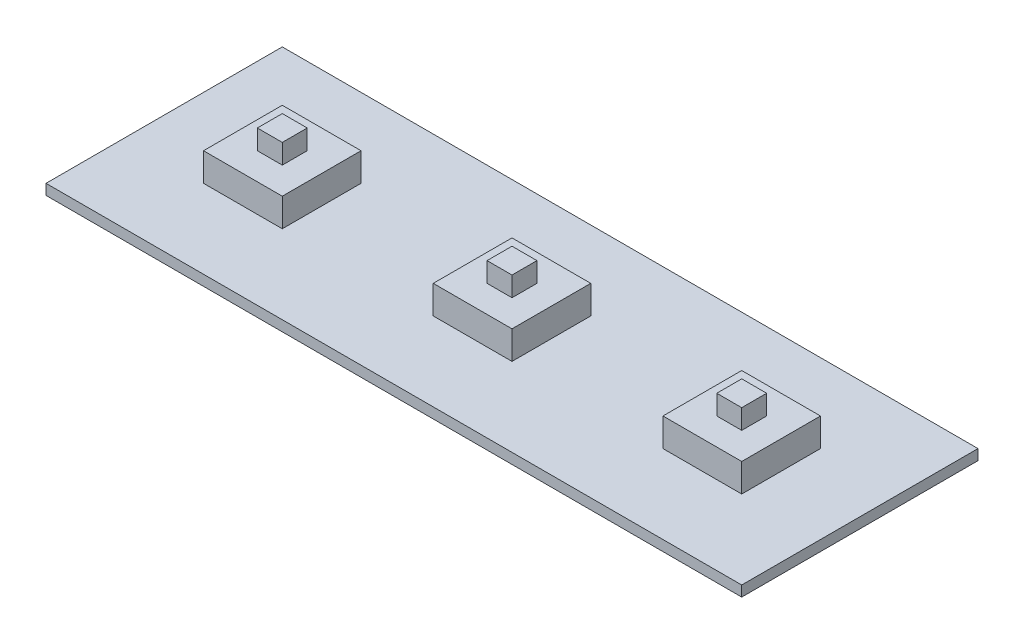
ISO-10303-21;
HEADER;
FILE_DESCRIPTION(('STEP AP214'),'2;1');
FILE_NAME('part.step','',(''),(''),'','','');
FILE_SCHEMA(('AUTOMOTIVE_DESIGN { 1 0 10303 214 1 1 1 1 }'));
ENDSEC;
DATA;
#1=APPLICATION_CONTEXT('core data for automotive mechanical design processes');
#2=APPLICATION_PROTOCOL_DEFINITION('international standard','automotive_design',2000,#1);
#3=PRODUCT_CONTEXT('',#1,'mechanical');
#4=PRODUCT('Part','Part','',(#3));
#5=PRODUCT_RELATED_PRODUCT_CATEGORY('part','',(#4));
#6=PRODUCT_DEFINITION_FORMATION('','',#4);
#7=PRODUCT_DEFINITION_CONTEXT('part definition',#1,'design');
#8=PRODUCT_DEFINITION('design','',#6,#7);
#9=PRODUCT_DEFINITION_SHAPE('','',#8);
#10=(LENGTH_UNIT() NAMED_UNIT(*) SI_UNIT(.MILLI.,.METRE.));
#11=(NAMED_UNIT(*) PLANE_ANGLE_UNIT() SI_UNIT($,.RADIAN.));
#12=(NAMED_UNIT(*) SI_UNIT($,.STERADIAN.) SOLID_ANGLE_UNIT());
#13=UNCERTAINTY_MEASURE_WITH_UNIT(LENGTH_MEASURE(1.E-05),#10,'distance_accuracy_value','');
#14=(GEOMETRIC_REPRESENTATION_CONTEXT(3) GLOBAL_UNCERTAINTY_ASSIGNED_CONTEXT((#13)) GLOBAL_UNIT_ASSIGNED_CONTEXT((#10,
#11,#12)) REPRESENTATION_CONTEXT('',''));
#15=CARTESIAN_POINT('',(0.,0.,0.));
#16=DIRECTION('',(0.,0.,1.));
#17=DIRECTION('',(1.,0.,0.));
#18=AXIS2_PLACEMENT_3D('',#15,#16,#17);
#19=CARTESIAN_POINT('',(0.,0.,0.));
#20=DIRECTION('',(0.,-1.,0.));
#21=DIRECTION('',(0.,0.,-1.));
#22=AXIS2_PLACEMENT_3D('',#19,#20,#21);
#23=PLANE('',#22);
#24=DIRECTION('',(0.,0.,1.));
#25=VECTOR('',#24,1.);
#26=CARTESIAN_POINT('',(35.,0.,-12.));
#27=LINE('',#26,#25);
#28=CARTESIAN_POINT('',(35.,0.,-12.));
#29=VERTEX_POINT('',#28);
#30=CARTESIAN_POINT('',(35.,0.,0.));
#31=VERTEX_POINT('',#30);
#32=EDGE_CURVE('E316',#29,#31,#27,.T.);
#33=ORIENTED_EDGE('',*,*,#32,.F.);
#34=DIRECTION('',(-1.,0.,0.));
#35=VECTOR('',#34,1.);
#36=CARTESIAN_POINT('',(35.,0.,-12.));
#37=LINE('',#36,#35);
#38=CARTESIAN_POINT('',(47.,0.,-12.));
#39=VERTEX_POINT('',#38);
#40=EDGE_CURVE('E321',#39,#29,#37,.T.);
#41=ORIENTED_EDGE('',*,*,#40,.F.);
#42=DIRECTION('',(0.,0.,-1.));
#43=VECTOR('',#42,1.);
#44=CARTESIAN_POINT('',(47.,0.,-12.));
#45=LINE('',#44,#43);
#46=CARTESIAN_POINT('',(47.,0.,0.));
#47=VERTEX_POINT('',#46);
#48=EDGE_CURVE('E333',#47,#39,#45,.T.);
#49=ORIENTED_EDGE('',*,*,#48,.F.);
#50=DIRECTION('',(1.,0.,0.));
#51=VECTOR('',#50,1.);
#52=CARTESIAN_POINT('',(35.,0.,0.));
#53=LINE('',#52,#51);
#54=EDGE_CURVE('E330',#31,#47,#53,.T.);
#55=ORIENTED_EDGE('',*,*,#54,.F.);
#56=EDGE_LOOP('',(#33,#41,#49,#55));
#57=FACE_BOUND('',#56,.T.);
#58=DIRECTION('',(0.,0.,1.));
#59=VECTOR('',#58,1.);
#60=CARTESIAN_POINT('',(0.,0.,0.));
#61=LINE('',#60,#59);
#62=CARTESIAN_POINT('',(0.,0.,-12.));
#63=VERTEX_POINT('',#62);
#64=CARTESIAN_POINT('',(0.,0.,0.));
#65=VERTEX_POINT('',#64);
#66=EDGE_CURVE('E410',#63,#65,#61,.T.);
#67=ORIENTED_EDGE('',*,*,#66,.F.);
#68=DIRECTION('',(-1.,0.,0.));
#69=VECTOR('',#68,1.);
#70=CARTESIAN_POINT('',(0.,0.,-12.));
#71=LINE('',#70,#69);
#72=CARTESIAN_POINT('',(12.,0.,-12.));
#73=VERTEX_POINT('',#72);
#74=EDGE_CURVE('E415',#73,#63,#71,.T.);
#75=ORIENTED_EDGE('',*,*,#74,.F.);
#76=DIRECTION('',(0.,0.,-1.));
#77=VECTOR('',#76,1.);
#78=CARTESIAN_POINT('',(12.,0.,0.));
#79=LINE('',#78,#77);
#80=CARTESIAN_POINT('',(12.,0.,0.));
#81=VERTEX_POINT('',#80);
#82=EDGE_CURVE('E427',#81,#73,#79,.T.);
#83=ORIENTED_EDGE('',*,*,#82,.F.);
#84=DIRECTION('',(1.,0.,0.));
#85=VECTOR('',#84,1.);
#86=CARTESIAN_POINT('',(0.,0.,0.));
#87=LINE('',#86,#85);
#88=EDGE_CURVE('E424',#65,#81,#87,.T.);
#89=ORIENTED_EDGE('',*,*,#88,.F.);
#90=EDGE_LOOP('',(#67,#75,#83,#89));
#91=FACE_BOUND('',#90,.T.);
#92=DIRECTION('',(0.,0.,-1.));
#93=VECTOR('',#92,1.);
#94=CARTESIAN_POINT('',(-12.,0.,12.));
#95=LINE('',#94,#93);
#96=CARTESIAN_POINT('',(-12.,0.,12.));
#97=VERTEX_POINT('',#96);
#98=CARTESIAN_POINT('',(-12.,0.,-24.));
#99=VERTEX_POINT('',#98);
#100=EDGE_CURVE('E349',#97,#99,#95,.T.);
#101=ORIENTED_EDGE('',*,*,#100,.F.);
#102=DIRECTION('',(-1.,0.,0.));
#103=VECTOR('',#102,1.);
#104=CARTESIAN_POINT('',(-12.,0.,12.));
#105=LINE('',#104,#103);
#106=CARTESIAN_POINT('',(94.,0.,12.));
#107=VERTEX_POINT('',#106);
#108=EDGE_CURVE('E354',#107,#97,#105,.T.);
#109=ORIENTED_EDGE('',*,*,#108,.F.);
#110=DIRECTION('',(0.,0.,1.));
#111=VECTOR('',#110,1.);
#112=CARTESIAN_POINT('',(94.,0.,12.));
#113=LINE('',#112,#111);
#114=CARTESIAN_POINT('',(94.,0.,-24.));
#115=VERTEX_POINT('',#114);
#116=EDGE_CURVE('E365',#115,#107,#113,.T.);
#117=ORIENTED_EDGE('',*,*,#116,.F.);
#118=DIRECTION('',(1.,0.,0.));
#119=VECTOR('',#118,1.);
#120=CARTESIAN_POINT('',(-12.,0.,-24.));
#121=LINE('',#120,#119);
#122=EDGE_CURVE('E363',#99,#115,#121,.T.);
#123=ORIENTED_EDGE('',*,*,#122,.F.);
#124=EDGE_LOOP('',(#101,#109,#117,#123));
#125=FACE_BOUND('',#124,.T.);
#126=DIRECTION('',(0.,0.,1.));
#127=VECTOR('',#126,1.);
#128=CARTESIAN_POINT('',(70.,0.,-12.));
#129=LINE('',#128,#127);
#130=CARTESIAN_POINT('',(70.,0.,-12.));
#131=VERTEX_POINT('',#130);
#132=CARTESIAN_POINT('',(70.,0.,0.));
#133=VERTEX_POINT('',#132);
#134=EDGE_CURVE('E283',#131,#133,#129,.T.);
#135=ORIENTED_EDGE('',*,*,#134,.F.);
#136=DIRECTION('',(-1.,0.,0.));
#137=VECTOR('',#136,1.);
#138=CARTESIAN_POINT('',(70.,0.,-12.));
#139=LINE('',#138,#137);
#140=CARTESIAN_POINT('',(82.,0.,-12.));
#141=VERTEX_POINT('',#140);
#142=EDGE_CURVE('E288',#141,#131,#139,.T.);
#143=ORIENTED_EDGE('',*,*,#142,.F.);
#144=DIRECTION('',(0.,0.,-1.));
#145=VECTOR('',#144,1.);
#146=CARTESIAN_POINT('',(82.,0.,-12.));
#147=LINE('',#146,#145);
#148=CARTESIAN_POINT('',(82.,0.,0.));
#149=VERTEX_POINT('',#148);
#150=EDGE_CURVE('E300',#149,#141,#147,.T.);
#151=ORIENTED_EDGE('',*,*,#150,.F.);
#152=DIRECTION('',(1.,0.,0.));
#153=VECTOR('',#152,1.);
#154=CARTESIAN_POINT('',(70.,0.,0.));
#155=LINE('',#154,#153);
#156=EDGE_CURVE('E297',#133,#149,#155,.T.);
#157=ORIENTED_EDGE('',*,*,#156,.F.);
#158=EDGE_LOOP('',(#135,#143,#151,#157));
#159=FACE_BOUND('',#158,.T.);
#160=ADVANCED_FACE('F35',(#57,#91,#125,#159),#23,.F.);
#161=CARTESIAN_POINT('',(0.,4.3,0.));
#162=DIRECTION('',(1.,0.,0.));
#163=DIRECTION('',(0.,0.,-1.));
#164=AXIS2_PLACEMENT_3D('',#161,#162,#163);
#165=PLANE('',#164);
#166=ORIENTED_EDGE('',*,*,#66,.T.);
#167=DIRECTION('',(0.,-1.,0.));
#168=VECTOR('',#167,1.);
#169=CARTESIAN_POINT('',(0.,4.3,0.));
#170=LINE('',#169,#168);
#171=CARTESIAN_POINT('',(0.,4.3,0.));
#172=VERTEX_POINT('',#171);
#173=EDGE_CURVE('E11',#172,#65,#170,.T.);
#174=ORIENTED_EDGE('',*,*,#173,.F.);
#175=DIRECTION('',(0.,0.,1.));
#176=VECTOR('',#175,1.);
#177=CARTESIAN_POINT('',(0.,4.3,0.));
#178=LINE('',#177,#176);
#179=CARTESIAN_POINT('',(0.,4.3,-12.));
#180=VERTEX_POINT('',#179);
#181=EDGE_CURVE('E411',#180,#172,#178,.T.);
#182=ORIENTED_EDGE('',*,*,#181,.F.);
#183=DIRECTION('',(0.,-1.,0.));
#184=VECTOR('',#183,1.);
#185=CARTESIAN_POINT('',(0.,4.3,-12.));
#186=LINE('',#185,#184);
#187=EDGE_CURVE('E421',#180,#63,#186,.T.);
#188=ORIENTED_EDGE('',*,*,#187,.T.);
#189=EDGE_LOOP('',(#166,#174,#182,#188));
#190=FACE_BOUND('',#189,.T.);
#191=ADVANCED_FACE('F37',(#190),#165,.F.);
#192=CARTESIAN_POINT('',(0.,4.3,0.));
#193=DIRECTION('',(0.,0.,-1.));
#194=DIRECTION('',(-1.,0.,0.));
#195=AXIS2_PLACEMENT_3D('',#192,#193,#194);
#196=PLANE('',#195);
#197=ORIENTED_EDGE('',*,*,#88,.T.);
#198=DIRECTION('',(0.,-1.,0.));
#199=VECTOR('',#198,1.);
#200=CARTESIAN_POINT('',(12.,4.3,0.));
#201=LINE('',#200,#199);
#202=CARTESIAN_POINT('',(12.,4.3,0.));
#203=VERTEX_POINT('',#202);
#204=EDGE_CURVE('E43',#203,#81,#201,.T.);
#205=ORIENTED_EDGE('',*,*,#204,.F.);
#206=DIRECTION('',(1.,0.,0.));
#207=VECTOR('',#206,1.);
#208=CARTESIAN_POINT('',(0.,4.3,0.));
#209=LINE('',#208,#207);
#210=EDGE_CURVE('E414',#172,#203,#209,.T.);
#211=ORIENTED_EDGE('',*,*,#210,.F.);
#212=ORIENTED_EDGE('',*,*,#173,.T.);
#213=EDGE_LOOP('',(#197,#205,#211,#212));
#214=FACE_BOUND('',#213,.T.);
#215=ADVANCED_FACE('F443',(#214),#196,.F.);
#216=CARTESIAN_POINT('',(12.,4.3,0.));
#217=DIRECTION('',(-1.,0.,0.));
#218=DIRECTION('',(0.,0.,1.));
#219=AXIS2_PLACEMENT_3D('',#216,#217,#218);
#220=PLANE('',#219);
#221=ORIENTED_EDGE('',*,*,#82,.T.);
#222=DIRECTION('',(0.,-1.,0.));
#223=VECTOR('',#222,1.);
#224=CARTESIAN_POINT('',(12.,4.3,-12.));
#225=LINE('',#224,#223);
#226=CARTESIAN_POINT('',(12.,4.3,-12.));
#227=VERTEX_POINT('',#226);
#228=EDGE_CURVE('E434',#227,#73,#225,.T.);
#229=ORIENTED_EDGE('',*,*,#228,.F.);
#230=DIRECTION('',(0.,0.,-1.));
#231=VECTOR('',#230,1.);
#232=CARTESIAN_POINT('',(12.,4.3,0.));
#233=LINE('',#232,#231);
#234=EDGE_CURVE('E417',#203,#227,#233,.T.);
#235=ORIENTED_EDGE('',*,*,#234,.F.);
#236=ORIENTED_EDGE('',*,*,#204,.T.);
#237=EDGE_LOOP('',(#221,#229,#235,#236));
#238=FACE_BOUND('',#237,.T.);
#239=ADVANCED_FACE('F440',(#238),#220,.F.);
#240=CARTESIAN_POINT('',(0.,4.3,-12.));
#241=DIRECTION('',(0.,0.,1.));
#242=DIRECTION('',(1.,0.,0.));
#243=AXIS2_PLACEMENT_3D('',#240,#241,#242);
#244=PLANE('',#243);
#245=ORIENTED_EDGE('',*,*,#74,.T.);
#246=ORIENTED_EDGE('',*,*,#187,.F.);
#247=DIRECTION('',(-1.,0.,0.));
#248=VECTOR('',#247,1.);
#249=CARTESIAN_POINT('',(0.,4.3,-12.));
#250=LINE('',#249,#248);
#251=EDGE_CURVE('E419',#227,#180,#250,.T.);
#252=ORIENTED_EDGE('',*,*,#251,.F.);
#253=ORIENTED_EDGE('',*,*,#228,.T.);
#254=EDGE_LOOP('',(#245,#246,#252,#253));
#255=FACE_BOUND('',#254,.T.);
#256=ADVANCED_FACE('F449',(#255),#244,.F.);
#257=CARTESIAN_POINT('',(0.,4.3,0.));
#258=DIRECTION('',(0.,-1.,0.));
#259=DIRECTION('',(0.,0.,-1.));
#260=AXIS2_PLACEMENT_3D('',#257,#258,#259);
#261=PLANE('',#260);
#262=DIRECTION('',(1.,0.,0.));
#263=VECTOR('',#262,1.);
#264=CARTESIAN_POINT('',(0.,4.3,-7.9));
#265=LINE('',#264,#263);
#266=CARTESIAN_POINT('',(4.1,4.3,-7.9));
#267=VERTEX_POINT('',#266);
#268=CARTESIAN_POINT('',(7.9,4.3,-7.9));
#269=VERTEX_POINT('',#268);
#270=EDGE_CURVE('E394',#267,#269,#265,.T.);
#271=ORIENTED_EDGE('',*,*,#270,.T.);
#272=DIRECTION('',(0.,0.,1.));
#273=VECTOR('',#272,1.);
#274=CARTESIAN_POINT('',(7.9,4.3,0.));
#275=LINE('',#274,#273);
#276=CARTESIAN_POINT('',(7.9,4.3,-4.1));
#277=VERTEX_POINT('',#276);
#278=EDGE_CURVE('E379',#269,#277,#275,.T.);
#279=ORIENTED_EDGE('',*,*,#278,.T.);
#280=DIRECTION('',(1.,0.,0.));
#281=VECTOR('',#280,1.);
#282=CARTESIAN_POINT('',(0.,4.3,-4.1));
#283=LINE('',#282,#281);
#284=CARTESIAN_POINT('',(4.1,4.3,-4.1));
#285=VERTEX_POINT('',#284);
#286=EDGE_CURVE('E384',#285,#277,#283,.T.);
#287=ORIENTED_EDGE('',*,*,#286,.F.);
#288=DIRECTION('',(0.,0.,1.));
#289=VECTOR('',#288,1.);
#290=CARTESIAN_POINT('',(4.1,4.3,0.));
#291=LINE('',#290,#289);
#292=EDGE_CURVE('E397',#267,#285,#291,.T.);
#293=ORIENTED_EDGE('',*,*,#292,.F.);
#294=EDGE_LOOP('',(#271,#279,#287,#293));
#295=FACE_BOUND('',#294,.T.);
#296=ORIENTED_EDGE('',*,*,#181,.T.);
#297=ORIENTED_EDGE('',*,*,#210,.T.);
#298=ORIENTED_EDGE('',*,*,#234,.T.);
#299=ORIENTED_EDGE('',*,*,#251,.T.);
#300=EDGE_LOOP('',(#296,#297,#298,#299));
#301=FACE_BOUND('',#300,.T.);
#302=ADVANCED_FACE('F454',(#295,#301),#261,.F.);
#303=CARTESIAN_POINT('',(7.9,7.3,0.));
#304=DIRECTION('',(1.,0.,0.));
#305=DIRECTION('',(0.,0.,-1.));
#306=AXIS2_PLACEMENT_3D('',#303,#304,#305);
#307=PLANE('',#306);
#308=ORIENTED_EDGE('',*,*,#278,.F.);
#309=DIRECTION('',(0.,-1.,0.));
#310=VECTOR('',#309,1.);
#311=CARTESIAN_POINT('',(7.9,7.3,-7.9));
#312=LINE('',#311,#310);
#313=CARTESIAN_POINT('',(7.9,7.3,-7.9));
#314=VERTEX_POINT('',#313);
#315=EDGE_CURVE('E407',#314,#269,#312,.T.);
#316=ORIENTED_EDGE('',*,*,#315,.F.);
#317=DIRECTION('',(0.,0.,1.));
#318=VECTOR('',#317,1.);
#319=CARTESIAN_POINT('',(7.9,7.3,0.));
#320=LINE('',#319,#318);
#321=CARTESIAN_POINT('',(7.9,7.3,-4.1));
#322=VERTEX_POINT('',#321);
#323=EDGE_CURVE('E380',#314,#322,#320,.T.);
#324=ORIENTED_EDGE('',*,*,#323,.T.);
#325=DIRECTION('',(0.,-1.,0.));
#326=VECTOR('',#325,1.);
#327=CARTESIAN_POINT('',(7.9,7.3,-4.1));
#328=LINE('',#327,#326);
#329=EDGE_CURVE('E391',#322,#277,#328,.T.);
#330=ORIENTED_EDGE('',*,*,#329,.T.);
#331=EDGE_LOOP('',(#308,#316,#324,#330));
#332=FACE_BOUND('',#331,.T.);
#333=ADVANCED_FACE('F456',(#332),#307,.T.);
#334=CARTESIAN_POINT('',(0.,7.3,-7.9));
#335=DIRECTION('',(0.,0.,-1.));
#336=DIRECTION('',(-1.,0.,0.));
#337=AXIS2_PLACEMENT_3D('',#334,#335,#336);
#338=PLANE('',#337);
#339=ORIENTED_EDGE('',*,*,#270,.F.);
#340=DIRECTION('',(0.,-1.,0.));
#341=VECTOR('',#340,1.);
#342=CARTESIAN_POINT('',(4.1,7.3,-7.9));
#343=LINE('',#342,#341);
#344=CARTESIAN_POINT('',(4.1,7.3,-7.9));
#345=VERTEX_POINT('',#344);
#346=EDGE_CURVE('E405',#345,#267,#343,.T.);
#347=ORIENTED_EDGE('',*,*,#346,.F.);
#348=DIRECTION('',(1.,0.,0.));
#349=VECTOR('',#348,1.);
#350=CARTESIAN_POINT('',(0.,7.3,-7.9));
#351=LINE('',#350,#349);
#352=EDGE_CURVE('E383',#345,#314,#351,.T.);
#353=ORIENTED_EDGE('',*,*,#352,.T.);
#354=ORIENTED_EDGE('',*,*,#315,.T.);
#355=EDGE_LOOP('',(#339,#347,#353,#354));
#356=FACE_BOUND('',#355,.T.);
#357=ADVANCED_FACE('F463',(#356),#338,.T.);
#358=CARTESIAN_POINT('',(4.1,7.3,0.));
#359=DIRECTION('',(1.,0.,0.));
#360=DIRECTION('',(0.,0.,-1.));
#361=AXIS2_PLACEMENT_3D('',#358,#359,#360);
#362=PLANE('',#361);
#363=ORIENTED_EDGE('',*,*,#292,.T.);
#364=DIRECTION('',(0.,-1.,0.));
#365=VECTOR('',#364,1.);
#366=CARTESIAN_POINT('',(4.1,7.3,-4.1));
#367=LINE('',#366,#365);
#368=CARTESIAN_POINT('',(4.1,7.3,-4.1));
#369=VERTEX_POINT('',#368);
#370=EDGE_CURVE('E402',#369,#285,#367,.T.);
#371=ORIENTED_EDGE('',*,*,#370,.F.);
#372=DIRECTION('',(0.,0.,1.));
#373=VECTOR('',#372,1.);
#374=CARTESIAN_POINT('',(4.1,7.3,0.));
#375=LINE('',#374,#373);
#376=EDGE_CURVE('E387',#345,#369,#375,.T.);
#377=ORIENTED_EDGE('',*,*,#376,.F.);
#378=ORIENTED_EDGE('',*,*,#346,.T.);
#379=EDGE_LOOP('',(#363,#371,#377,#378));
#380=FACE_BOUND('',#379,.T.);
#381=ADVANCED_FACE('F501',(#380),#362,.F.);
#382=CARTESIAN_POINT('',(0.,7.3,-4.1));
#383=DIRECTION('',(0.,0.,-1.));
#384=DIRECTION('',(-1.,0.,0.));
#385=AXIS2_PLACEMENT_3D('',#382,#383,#384);
#386=PLANE('',#385);
#387=ORIENTED_EDGE('',*,*,#286,.T.);
#388=ORIENTED_EDGE('',*,*,#329,.F.);
#389=DIRECTION('',(1.,0.,0.));
#390=VECTOR('',#389,1.);
#391=CARTESIAN_POINT('',(0.,7.3,-4.1));
#392=LINE('',#391,#390);
#393=EDGE_CURVE('E389',#369,#322,#392,.T.);
#394=ORIENTED_EDGE('',*,*,#393,.F.);
#395=ORIENTED_EDGE('',*,*,#370,.T.);
#396=EDGE_LOOP('',(#387,#388,#394,#395));
#397=FACE_BOUND('',#396,.T.);
#398=ADVANCED_FACE('F497',(#397),#386,.F.);
#399=CARTESIAN_POINT('',(0.,7.3,0.));
#400=DIRECTION('',(0.,1.,0.));
#401=DIRECTION('',(0.,0.,1.));
#402=AXIS2_PLACEMENT_3D('',#399,#400,#401);
#403=PLANE('',#402);
#404=ORIENTED_EDGE('',*,*,#323,.F.);
#405=ORIENTED_EDGE('',*,*,#352,.F.);
#406=ORIENTED_EDGE('',*,*,#376,.T.);
#407=ORIENTED_EDGE('',*,*,#393,.T.);
#408=EDGE_LOOP('',(#404,#405,#406,#407));
#409=FACE_BOUND('',#408,.T.);
#410=ADVANCED_FACE('F494',(#409),#403,.T.);
#411=CARTESIAN_POINT('',(-12.,-1.6,12.));
#412=DIRECTION('',(1.,0.,0.));
#413=DIRECTION('',(0.,0.,-1.));
#414=AXIS2_PLACEMENT_3D('',#411,#412,#413);
#415=PLANE('',#414);
#416=ORIENTED_EDGE('',*,*,#100,.T.);
#417=DIRECTION('',(0.,1.,0.));
#418=VECTOR('',#417,1.);
#419=CARTESIAN_POINT('',(-12.,-1.6,-24.));
#420=LINE('',#419,#418);
#421=CARTESIAN_POINT('',(-12.,-1.6,-24.));
#422=VERTEX_POINT('',#421);
#423=EDGE_CURVE('E376',#422,#99,#420,.T.);
#424=ORIENTED_EDGE('',*,*,#423,.F.);
#425=DIRECTION('',(0.,0.,-1.));
#426=VECTOR('',#425,1.);
#427=CARTESIAN_POINT('',(-12.,-1.6,12.));
#428=LINE('',#427,#426);
#429=CARTESIAN_POINT('',(-12.,-1.6,12.));
#430=VERTEX_POINT('',#429);
#431=EDGE_CURVE('E350',#430,#422,#428,.T.);
#432=ORIENTED_EDGE('',*,*,#431,.F.);
#433=DIRECTION('',(0.,1.,0.));
#434=VECTOR('',#433,1.);
#435=CARTESIAN_POINT('',(-12.,-1.6,12.));
#436=LINE('',#435,#434);
#437=EDGE_CURVE('E360',#430,#97,#436,.T.);
#438=ORIENTED_EDGE('',*,*,#437,.T.);
#439=EDGE_LOOP('',(#416,#424,#432,#438));
#440=FACE_BOUND('',#439,.T.);
#441=ADVANCED_FACE('F491',(#440),#415,.F.);
#442=CARTESIAN_POINT('',(-12.,-1.6,-24.));
#443=DIRECTION('',(0.,0.,1.));
#444=DIRECTION('',(1.,0.,0.));
#445=AXIS2_PLACEMENT_3D('',#442,#443,#444);
#446=PLANE('',#445);
#447=ORIENTED_EDGE('',*,*,#122,.T.);
#448=DIRECTION('',(0.,1.,0.));
#449=VECTOR('',#448,1.);
#450=CARTESIAN_POINT('',(94.,-1.6,-24.));
#451=LINE('',#450,#449);
#452=CARTESIAN_POINT('',(94.,-1.6,-24.));
#453=VERTEX_POINT('',#452);
#454=EDGE_CURVE('E373',#453,#115,#451,.T.);
#455=ORIENTED_EDGE('',*,*,#454,.F.);
#456=DIRECTION('',(1.,0.,0.));
#457=VECTOR('',#456,1.);
#458=CARTESIAN_POINT('',(-12.,-1.6,-24.));
#459=LINE('',#458,#457);
#460=EDGE_CURVE('E353',#422,#453,#459,.T.);
#461=ORIENTED_EDGE('',*,*,#460,.F.);
#462=ORIENTED_EDGE('',*,*,#423,.T.);
#463=EDGE_LOOP('',(#447,#455,#461,#462));
#464=FACE_BOUND('',#463,.T.);
#465=ADVANCED_FACE('F487',(#464),#446,.F.);
#466=CARTESIAN_POINT('',(94.,-1.6,12.));
#467=DIRECTION('',(-1.,0.,0.));
#468=DIRECTION('',(0.,0.,1.));
#469=AXIS2_PLACEMENT_3D('',#466,#467,#468);
#470=PLANE('',#469);
#471=ORIENTED_EDGE('',*,*,#116,.T.);
#472=DIRECTION('',(0.,1.,0.));
#473=VECTOR('',#472,1.);
#474=CARTESIAN_POINT('',(94.,-1.6,12.));
#475=LINE('',#474,#473);
#476=CARTESIAN_POINT('',(94.,-1.6,12.));
#477=VERTEX_POINT('',#476);
#478=EDGE_CURVE('E370',#477,#107,#475,.T.);
#479=ORIENTED_EDGE('',*,*,#478,.F.);
#480=DIRECTION('',(0.,0.,1.));
#481=VECTOR('',#480,1.);
#482=CARTESIAN_POINT('',(94.,-1.6,12.));
#483=LINE('',#482,#481);
#484=EDGE_CURVE('E356',#453,#477,#483,.T.);
#485=ORIENTED_EDGE('',*,*,#484,.F.);
#486=ORIENTED_EDGE('',*,*,#454,.T.);
#487=EDGE_LOOP('',(#471,#479,#485,#486));
#488=FACE_BOUND('',#487,.T.);
#489=ADVANCED_FACE('F483',(#488),#470,.F.);
#490=CARTESIAN_POINT('',(-12.,-1.6,12.));
#491=DIRECTION('',(0.,0.,-1.));
#492=DIRECTION('',(-1.,0.,0.));
#493=AXIS2_PLACEMENT_3D('',#490,#491,#492);
#494=PLANE('',#493);
#495=ORIENTED_EDGE('',*,*,#108,.T.);
#496=ORIENTED_EDGE('',*,*,#437,.F.);
#497=DIRECTION('',(-1.,0.,0.));
#498=VECTOR('',#497,1.);
#499=CARTESIAN_POINT('',(-12.,-1.6,12.));
#500=LINE('',#499,#498);
#501=EDGE_CURVE('E358',#477,#430,#500,.T.);
#502=ORIENTED_EDGE('',*,*,#501,.F.);
#503=ORIENTED_EDGE('',*,*,#478,.T.);
#504=EDGE_LOOP('',(#495,#496,#502,#503));
#505=FACE_BOUND('',#504,.T.);
#506=ADVANCED_FACE('F480',(#505),#494,.F.);
#507=CARTESIAN_POINT('',(0.,-1.6,0.));
#508=DIRECTION('',(0.,-1.,0.));
#509=DIRECTION('',(0.,0.,-1.));
#510=AXIS2_PLACEMENT_3D('',#507,#508,#509);
#511=PLANE('',#510);
#512=ORIENTED_EDGE('',*,*,#431,.T.);
#513=ORIENTED_EDGE('',*,*,#460,.T.);
#514=ORIENTED_EDGE('',*,*,#484,.T.);
#515=ORIENTED_EDGE('',*,*,#501,.T.);
#516=EDGE_LOOP('',(#512,#513,#514,#515));
#517=FACE_BOUND('',#516,.T.);
#518=ADVANCED_FACE('F478',(#517),#511,.T.);
#519=CARTESIAN_POINT('',(35.,4.3,-12.));
#520=DIRECTION('',(1.,0.,0.));
#521=DIRECTION('',(0.,0.,-1.));
#522=AXIS2_PLACEMENT_3D('',#519,#520,#521);
#523=PLANE('',#522);
#524=ORIENTED_EDGE('',*,*,#32,.T.);
#525=DIRECTION('',(0.,-1.,0.));
#526=VECTOR('',#525,1.);
#527=CARTESIAN_POINT('',(35.,4.3,0.));
#528=LINE('',#527,#526);
#529=CARTESIAN_POINT('',(35.,4.3,0.));
#530=VERTEX_POINT('',#529);
#531=EDGE_CURVE('E346',#530,#31,#528,.T.);
#532=ORIENTED_EDGE('',*,*,#531,.F.);
#533=DIRECTION('',(0.,0.,1.));
#534=VECTOR('',#533,1.);
#535=CARTESIAN_POINT('',(35.,4.3,-12.));
#536=LINE('',#535,#534);
#537=CARTESIAN_POINT('',(35.,4.3,-12.));
#538=VERTEX_POINT('',#537);
#539=EDGE_CURVE('E317',#538,#530,#536,.T.);
#540=ORIENTED_EDGE('',*,*,#539,.F.);
#541=DIRECTION('',(0.,-1.,0.));
#542=VECTOR('',#541,1.);
#543=CARTESIAN_POINT('',(35.,4.3,-12.));
#544=LINE('',#543,#542);
#545=EDGE_CURVE('E327',#538,#29,#544,.T.);
#546=ORIENTED_EDGE('',*,*,#545,.T.);
#547=EDGE_LOOP('',(#524,#532,#540,#546));
#548=FACE_BOUND('',#547,.T.);
#549=ADVANCED_FACE('F583',(#548),#523,.F.);
#550=CARTESIAN_POINT('',(35.,4.3,0.));
#551=DIRECTION('',(0.,0.,-1.));
#552=DIRECTION('',(-1.,0.,0.));
#553=AXIS2_PLACEMENT_3D('',#550,#551,#552);
#554=PLANE('',#553);
#555=ORIENTED_EDGE('',*,*,#54,.T.);
#556=DIRECTION('',(0.,-1.,0.));
#557=VECTOR('',#556,1.);
#558=CARTESIAN_POINT('',(47.,4.3,0.));
#559=LINE('',#558,#557);
#560=CARTESIAN_POINT('',(47.,4.3,0.));
#561=VERTEX_POINT('',#560);
#562=EDGE_CURVE('E343',#561,#47,#559,.T.);
#563=ORIENTED_EDGE('',*,*,#562,.F.);
#564=DIRECTION('',(1.,0.,0.));
#565=VECTOR('',#564,1.);
#566=CARTESIAN_POINT('',(35.,4.3,0.));
#567=LINE('',#566,#565);
#568=EDGE_CURVE('E320',#530,#561,#567,.T.);
#569=ORIENTED_EDGE('',*,*,#568,.F.);
#570=ORIENTED_EDGE('',*,*,#531,.T.);
#571=EDGE_LOOP('',(#555,#563,#569,#570));
#572=FACE_BOUND('',#571,.T.);
#573=ADVANCED_FACE('F597',(#572),#554,.F.);
#574=CARTESIAN_POINT('',(47.,4.3,-12.));
#575=DIRECTION('',(-1.,0.,0.));
#576=DIRECTION('',(0.,0.,1.));
#577=AXIS2_PLACEMENT_3D('',#574,#575,#576);
#578=PLANE('',#577);
#579=ORIENTED_EDGE('',*,*,#48,.T.);
#580=DIRECTION('',(0.,-1.,0.));
#581=VECTOR('',#580,1.);
#582=CARTESIAN_POINT('',(47.,4.3,-12.));
#583=LINE('',#582,#581);
#584=CARTESIAN_POINT('',(47.,4.3,-12.));
#585=VERTEX_POINT('',#584);
#586=EDGE_CURVE('E340',#585,#39,#583,.T.);
#587=ORIENTED_EDGE('',*,*,#586,.F.);
#588=DIRECTION('',(0.,0.,-1.));
#589=VECTOR('',#588,1.);
#590=CARTESIAN_POINT('',(47.,4.3,-12.));
#591=LINE('',#590,#589);
#592=EDGE_CURVE('E323',#561,#585,#591,.T.);
#593=ORIENTED_EDGE('',*,*,#592,.F.);
#594=ORIENTED_EDGE('',*,*,#562,.T.);
#595=EDGE_LOOP('',(#579,#587,#593,#594));
#596=FACE_BOUND('',#595,.T.);
#597=ADVANCED_FACE('F606',(#596),#578,.F.);
#598=CARTESIAN_POINT('',(35.,4.3,-12.));
#599=DIRECTION('',(0.,0.,1.));
#600=DIRECTION('',(1.,0.,0.));
#601=AXIS2_PLACEMENT_3D('',#598,#599,#600);
#602=PLANE('',#601);
#603=ORIENTED_EDGE('',*,*,#40,.T.);
#604=ORIENTED_EDGE('',*,*,#545,.F.);
#605=DIRECTION('',(-1.,0.,0.));
#606=VECTOR('',#605,1.);
#607=CARTESIAN_POINT('',(35.,4.3,-12.));
#608=LINE('',#607,#606);
#609=EDGE_CURVE('E325',#585,#538,#608,.T.);
#610=ORIENTED_EDGE('',*,*,#609,.F.);
#611=ORIENTED_EDGE('',*,*,#586,.T.);
#612=EDGE_LOOP('',(#603,#604,#610,#611));
#613=FACE_BOUND('',#612,.T.);
#614=ADVANCED_FACE('F616',(#613),#602,.F.);
#615=CARTESIAN_POINT('',(0.,4.3,0.));
#616=DIRECTION('',(0.,1.,0.));
#617=DIRECTION('',(0.,0.,1.));
#618=AXIS2_PLACEMENT_3D('',#615,#616,#617);
#619=PLANE('',#618);
#620=DIRECTION('',(1.,0.,0.));
#621=VECTOR('',#620,1.);
#622=CARTESIAN_POINT('',(39.1,4.3,-4.1));
#623=LINE('',#622,#621);
#624=CARTESIAN_POINT('',(39.1,4.3,-4.1));
#625=VERTEX_POINT('',#624);
#626=CARTESIAN_POINT('',(42.9,4.3,-4.1));
#627=VERTEX_POINT('',#626);
#628=EDGE_CURVE('E58',#625,#627,#623,.T.);
#629=ORIENTED_EDGE('',*,*,#628,.F.);
#630=DIRECTION('',(0.,0.,1.));
#631=VECTOR('',#630,1.);
#632=CARTESIAN_POINT('',(39.1,4.3,-7.9));
#633=LINE('',#632,#631);
#634=CARTESIAN_POINT('',(39.1,4.3,-7.9));
#635=VERTEX_POINT('',#634);
#636=EDGE_CURVE('E261',#635,#625,#633,.T.);
#637=ORIENTED_EDGE('',*,*,#636,.F.);
#638=DIRECTION('',(1.,0.,0.));
#639=VECTOR('',#638,1.);
#640=CARTESIAN_POINT('',(39.1,4.3,-7.9));
#641=LINE('',#640,#639);
#642=CARTESIAN_POINT('',(42.9,4.3,-7.9));
#643=VERTEX_POINT('',#642);
#644=EDGE_CURVE('E272',#635,#643,#641,.T.);
#645=ORIENTED_EDGE('',*,*,#644,.T.);
#646=DIRECTION('',(0.,0.,1.));
#647=VECTOR('',#646,1.);
#648=CARTESIAN_POINT('',(42.9,4.3,-7.9));
#649=LINE('',#648,#647);
#650=EDGE_CURVE('E245',#643,#627,#649,.T.);
#651=ORIENTED_EDGE('',*,*,#650,.T.);
#652=EDGE_LOOP('',(#629,#637,#645,#651));
#653=FACE_BOUND('',#652,.T.);
#654=ORIENTED_EDGE('',*,*,#539,.T.);
#655=ORIENTED_EDGE('',*,*,#568,.T.);
#656=ORIENTED_EDGE('',*,*,#592,.T.);
#657=ORIENTED_EDGE('',*,*,#609,.T.);
#658=EDGE_LOOP('',(#654,#655,#656,#657));
#659=FACE_BOUND('',#658,.T.);
#660=ADVANCED_FACE('F626',(#653,#659),#619,.T.);
#661=CARTESIAN_POINT('',(70.,4.3,-12.));
#662=DIRECTION('',(1.,0.,0.));
#663=DIRECTION('',(0.,0.,-1.));
#664=AXIS2_PLACEMENT_3D('',#661,#662,#663);
#665=PLANE('',#664);
#666=ORIENTED_EDGE('',*,*,#134,.T.);
#667=DIRECTION('',(0.,-1.,0.));
#668=VECTOR('',#667,1.);
#669=CARTESIAN_POINT('',(70.,4.3,0.));
#670=LINE('',#669,#668);
#671=CARTESIAN_POINT('',(70.,4.3,0.));
#672=VERTEX_POINT('',#671);
#673=EDGE_CURVE('E313',#672,#133,#670,.T.);
#674=ORIENTED_EDGE('',*,*,#673,.F.);
#675=DIRECTION('',(0.,0.,1.));
#676=VECTOR('',#675,1.);
#677=CARTESIAN_POINT('',(70.,4.3,-12.));
#678=LINE('',#677,#676);
#679=CARTESIAN_POINT('',(70.,4.3,-12.));
#680=VERTEX_POINT('',#679);
#681=EDGE_CURVE('E284',#680,#672,#678,.T.);
#682=ORIENTED_EDGE('',*,*,#681,.F.);
#683=DIRECTION('',(0.,-1.,0.));
#684=VECTOR('',#683,1.);
#685=CARTESIAN_POINT('',(70.,4.3,-12.));
#686=LINE('',#685,#684);
#687=EDGE_CURVE('E294',#680,#131,#686,.T.);
#688=ORIENTED_EDGE('',*,*,#687,.T.);
#689=EDGE_LOOP('',(#666,#674,#682,#688));
#690=FACE_BOUND('',#689,.T.);
#691=ADVANCED_FACE('F634',(#690),#665,.F.);
#692=CARTESIAN_POINT('',(70.,4.3,0.));
#693=DIRECTION('',(0.,0.,-1.));
#694=DIRECTION('',(-1.,0.,0.));
#695=AXIS2_PLACEMENT_3D('',#692,#693,#694);
#696=PLANE('',#695);
#697=ORIENTED_EDGE('',*,*,#156,.T.);
#698=DIRECTION('',(0.,-1.,0.));
#699=VECTOR('',#698,1.);
#700=CARTESIAN_POINT('',(82.,4.3,0.));
#701=LINE('',#700,#699);
#702=CARTESIAN_POINT('',(82.,4.3,0.));
#703=VERTEX_POINT('',#702);
#704=EDGE_CURVE('E310',#703,#149,#701,.T.);
#705=ORIENTED_EDGE('',*,*,#704,.F.);
#706=DIRECTION('',(1.,0.,0.));
#707=VECTOR('',#706,1.);
#708=CARTESIAN_POINT('',(70.,4.3,0.));
#709=LINE('',#708,#707);
#710=EDGE_CURVE('E287',#672,#703,#709,.T.);
#711=ORIENTED_EDGE('',*,*,#710,.F.);
#712=ORIENTED_EDGE('',*,*,#673,.T.);
#713=EDGE_LOOP('',(#697,#705,#711,#712));
#714=FACE_BOUND('',#713,.T.);
#715=ADVANCED_FACE('F639',(#714),#696,.F.);
#716=CARTESIAN_POINT('',(82.,4.3,-12.));
#717=DIRECTION('',(-1.,0.,0.));
#718=DIRECTION('',(0.,0.,1.));
#719=AXIS2_PLACEMENT_3D('',#716,#717,#718);
#720=PLANE('',#719);
#721=ORIENTED_EDGE('',*,*,#150,.T.);
#722=DIRECTION('',(0.,-1.,0.));
#723=VECTOR('',#722,1.);
#724=CARTESIAN_POINT('',(82.,4.3,-12.));
#725=LINE('',#724,#723);
#726=CARTESIAN_POINT('',(82.,4.3,-12.));
#727=VERTEX_POINT('',#726);
#728=EDGE_CURVE('E307',#727,#141,#725,.T.);
#729=ORIENTED_EDGE('',*,*,#728,.F.);
#730=DIRECTION('',(0.,0.,-1.));
#731=VECTOR('',#730,1.);
#732=CARTESIAN_POINT('',(82.,4.3,-12.));
#733=LINE('',#732,#731);
#734=EDGE_CURVE('E290',#703,#727,#733,.T.);
#735=ORIENTED_EDGE('',*,*,#734,.F.);
#736=ORIENTED_EDGE('',*,*,#704,.T.);
#737=EDGE_LOOP('',(#721,#729,#735,#736));
#738=FACE_BOUND('',#737,.T.);
#739=ADVANCED_FACE('F649',(#738),#720,.F.);
#740=CARTESIAN_POINT('',(70.,4.3,-12.));
#741=DIRECTION('',(0.,0.,1.));
#742=DIRECTION('',(1.,0.,0.));
#743=AXIS2_PLACEMENT_3D('',#740,#741,#742);
#744=PLANE('',#743);
#745=ORIENTED_EDGE('',*,*,#142,.T.);
#746=ORIENTED_EDGE('',*,*,#687,.F.);
#747=DIRECTION('',(-1.,0.,0.));
#748=VECTOR('',#747,1.);
#749=CARTESIAN_POINT('',(70.,4.3,-12.));
#750=LINE('',#749,#748);
#751=EDGE_CURVE('E292',#727,#680,#750,.T.);
#752=ORIENTED_EDGE('',*,*,#751,.F.);
#753=ORIENTED_EDGE('',*,*,#728,.T.);
#754=EDGE_LOOP('',(#745,#746,#752,#753));
#755=FACE_BOUND('',#754,.T.);
#756=ADVANCED_FACE('F659',(#755),#744,.F.);
#757=CARTESIAN_POINT('',(0.,4.3,0.));
#758=DIRECTION('',(0.,1.,0.));
#759=DIRECTION('',(0.,0.,1.));
#760=AXIS2_PLACEMENT_3D('',#757,#758,#759);
#761=PLANE('',#760);
#762=DIRECTION('',(1.,0.,0.));
#763=VECTOR('',#762,1.);
#764=CARTESIAN_POINT('',(74.1,4.3,-4.1));
#765=LINE('',#764,#763);
#766=CARTESIAN_POINT('',(74.1,4.3,-4.1));
#767=VERTEX_POINT('',#766);
#768=CARTESIAN_POINT('',(77.9,4.3,-4.1));
#769=VERTEX_POINT('',#768);
#770=EDGE_CURVE('E50',#767,#769,#765,.T.);
#771=ORIENTED_EDGE('',*,*,#770,.F.);
#772=DIRECTION('',(0.,0.,1.));
#773=VECTOR('',#772,1.);
#774=CARTESIAN_POINT('',(74.1,4.3,-7.9));
#775=LINE('',#774,#773);
#776=CARTESIAN_POINT('',(74.1,4.3,-7.9));
#777=VERTEX_POINT('',#776);
#778=EDGE_CURVE('E224',#777,#767,#775,.T.);
#779=ORIENTED_EDGE('',*,*,#778,.F.);
#780=DIRECTION('',(1.,0.,0.));
#781=VECTOR('',#780,1.);
#782=CARTESIAN_POINT('',(74.1,4.3,-7.9));
#783=LINE('',#782,#781);
#784=CARTESIAN_POINT('',(77.9,4.3,-7.9));
#785=VERTEX_POINT('',#784);
#786=EDGE_CURVE('E233',#777,#785,#783,.T.);
#787=ORIENTED_EDGE('',*,*,#786,.T.);
#788=DIRECTION('',(0.,0.,1.));
#789=VECTOR('',#788,1.);
#790=CARTESIAN_POINT('',(77.9,4.3,-7.9));
#791=LINE('',#790,#789);
#792=EDGE_CURVE('E243',#785,#769,#791,.T.);
#793=ORIENTED_EDGE('',*,*,#792,.T.);
#794=EDGE_LOOP('',(#771,#779,#787,#793));
#795=FACE_BOUND('',#794,.T.);
#796=ORIENTED_EDGE('',*,*,#681,.T.);
#797=ORIENTED_EDGE('',*,*,#710,.T.);
#798=ORIENTED_EDGE('',*,*,#734,.T.);
#799=ORIENTED_EDGE('',*,*,#751,.T.);
#800=EDGE_LOOP('',(#796,#797,#798,#799));
#801=FACE_BOUND('',#800,.T.);
#802=ADVANCED_FACE('F240',(#795,#801),#761,.T.);
#803=CARTESIAN_POINT('',(39.1,7.3,-4.1));
#804=DIRECTION('',(0.,0.,-1.));
#805=DIRECTION('',(-1.,0.,0.));
#806=AXIS2_PLACEMENT_3D('',#803,#804,#805);
#807=PLANE('',#806);
#808=ORIENTED_EDGE('',*,*,#628,.T.);
#809=DIRECTION('',(0.,-1.,0.));
#810=VECTOR('',#809,1.);
#811=CARTESIAN_POINT('',(42.9,7.3,-4.1));
#812=LINE('',#811,#810);
#813=CARTESIAN_POINT('',(42.9,7.3,-4.1));
#814=VERTEX_POINT('',#813);
#815=EDGE_CURVE('E281',#814,#627,#812,.T.);
#816=ORIENTED_EDGE('',*,*,#815,.F.);
#817=DIRECTION('',(1.,0.,0.));
#818=VECTOR('',#817,1.);
#819=CARTESIAN_POINT('',(39.1,7.3,-4.1));
#820=LINE('',#819,#818);
#821=CARTESIAN_POINT('',(39.1,7.3,-4.1));
#822=VERTEX_POINT('',#821);
#823=EDGE_CURVE('E258',#822,#814,#820,.T.);
#824=ORIENTED_EDGE('',*,*,#823,.F.);
#825=DIRECTION('',(0.,-1.,0.));
#826=VECTOR('',#825,1.);
#827=CARTESIAN_POINT('',(39.1,7.3,-4.1));
#828=LINE('',#827,#826);
#829=EDGE_CURVE('E268',#822,#625,#828,.T.);
#830=ORIENTED_EDGE('',*,*,#829,.T.);
#831=EDGE_LOOP('',(#808,#816,#824,#830));
#832=FACE_BOUND('',#831,.T.);
#833=ADVANCED_FACE('F685',(#832),#807,.F.);
#834=CARTESIAN_POINT('',(42.9,7.3,-7.9));
#835=DIRECTION('',(1.,0.,0.));
#836=DIRECTION('',(0.,0.,-1.));
#837=AXIS2_PLACEMENT_3D('',#834,#835,#836);
#838=PLANE('',#837);
#839=ORIENTED_EDGE('',*,*,#650,.F.);
#840=DIRECTION('',(0.,-1.,0.));
#841=VECTOR('',#840,1.);
#842=CARTESIAN_POINT('',(42.9,7.3,-7.9));
#843=LINE('',#842,#841);
#844=CARTESIAN_POINT('',(42.9,7.3,-7.9));
#845=VERTEX_POINT('',#844);
#846=EDGE_CURVE('E279',#845,#643,#843,.T.);
#847=ORIENTED_EDGE('',*,*,#846,.F.);
#848=DIRECTION('',(0.,0.,1.));
#849=VECTOR('',#848,1.);
#850=CARTESIAN_POINT('',(42.9,7.3,-7.9));
#851=LINE('',#850,#849);
#852=EDGE_CURVE('E260',#845,#814,#851,.T.);
#853=ORIENTED_EDGE('',*,*,#852,.T.);
#854=ORIENTED_EDGE('',*,*,#815,.T.);
#855=EDGE_LOOP('',(#839,#847,#853,#854));
#856=FACE_BOUND('',#855,.T.);
#857=ADVANCED_FACE('F694',(#856),#838,.T.);
#858=CARTESIAN_POINT('',(39.1,7.3,-7.9));
#859=DIRECTION('',(0.,0.,-1.));
#860=DIRECTION('',(-1.,0.,0.));
#861=AXIS2_PLACEMENT_3D('',#858,#859,#860);
#862=PLANE('',#861);
#863=ORIENTED_EDGE('',*,*,#644,.F.);
#864=DIRECTION('',(0.,-1.,0.));
#865=VECTOR('',#864,1.);
#866=CARTESIAN_POINT('',(39.1,7.3,-7.9));
#867=LINE('',#866,#865);
#868=CARTESIAN_POINT('',(39.1,7.3,-7.9));
#869=VERTEX_POINT('',#868);
#870=EDGE_CURVE('E277',#869,#635,#867,.T.);
#871=ORIENTED_EDGE('',*,*,#870,.F.);
#872=DIRECTION('',(1.,0.,0.));
#873=VECTOR('',#872,1.);
#874=CARTESIAN_POINT('',(39.1,7.3,-7.9));
#875=LINE('',#874,#873);
#876=EDGE_CURVE('E264',#869,#845,#875,.T.);
#877=ORIENTED_EDGE('',*,*,#876,.T.);
#878=ORIENTED_EDGE('',*,*,#846,.T.);
#879=EDGE_LOOP('',(#863,#871,#877,#878));
#880=FACE_BOUND('',#879,.T.);
#881=ADVANCED_FACE('F703',(#880),#862,.T.);
#882=CARTESIAN_POINT('',(39.1,7.3,-7.9));
#883=DIRECTION('',(1.,0.,0.));
#884=DIRECTION('',(0.,0.,-1.));
#885=AXIS2_PLACEMENT_3D('',#882,#883,#884);
#886=PLANE('',#885);
#887=ORIENTED_EDGE('',*,*,#636,.T.);
#888=ORIENTED_EDGE('',*,*,#829,.F.);
#889=DIRECTION('',(0.,0.,1.));
#890=VECTOR('',#889,1.);
#891=CARTESIAN_POINT('',(39.1,7.3,-7.9));
#892=LINE('',#891,#890);
#893=EDGE_CURVE('E267',#869,#822,#892,.T.);
#894=ORIENTED_EDGE('',*,*,#893,.F.);
#895=ORIENTED_EDGE('',*,*,#870,.T.);
#896=EDGE_LOOP('',(#887,#888,#894,#895));
#897=FACE_BOUND('',#896,.T.);
#898=ADVANCED_FACE('F713',(#897),#886,.F.);
#899=CARTESIAN_POINT('',(0.,7.3,0.));
#900=DIRECTION('',(0.,-1.,0.));
#901=DIRECTION('',(0.,0.,-1.));
#902=AXIS2_PLACEMENT_3D('',#899,#900,#901);
#903=PLANE('',#902);
#904=ORIENTED_EDGE('',*,*,#823,.T.);
#905=ORIENTED_EDGE('',*,*,#852,.F.);
#906=ORIENTED_EDGE('',*,*,#876,.F.);
#907=ORIENTED_EDGE('',*,*,#893,.T.);
#908=EDGE_LOOP('',(#904,#905,#906,#907));
#909=FACE_BOUND('',#908,.T.);
#910=ADVANCED_FACE('F723',(#909),#903,.F.);
#911=CARTESIAN_POINT('',(74.1,7.3,-4.1));
#912=DIRECTION('',(0.,0.,-1.));
#913=DIRECTION('',(-1.,0.,0.));
#914=AXIS2_PLACEMENT_3D('',#911,#912,#913);
#915=PLANE('',#914);
#916=ORIENTED_EDGE('',*,*,#770,.T.);
#917=DIRECTION('',(0.,-1.,0.));
#918=VECTOR('',#917,1.);
#919=CARTESIAN_POINT('',(77.9,7.3,-4.1));
#920=LINE('',#919,#918);
#921=CARTESIAN_POINT('',(77.9,7.3,-4.1));
#922=VERTEX_POINT('',#921);
#923=EDGE_CURVE('E785',#922,#769,#920,.T.);
#924=ORIENTED_EDGE('',*,*,#923,.F.);
#925=DIRECTION('',(1.,0.,0.));
#926=VECTOR('',#925,1.);
#927=CARTESIAN_POINT('',(74.1,7.3,-4.1));
#928=LINE('',#927,#926);
#929=CARTESIAN_POINT('',(74.1,7.3,-4.1));
#930=VERTEX_POINT('',#929);
#931=EDGE_CURVE('E234',#930,#922,#928,.T.);
#932=ORIENTED_EDGE('',*,*,#931,.F.);
#933=DIRECTION('',(0.,-1.,0.));
#934=VECTOR('',#933,1.);
#935=CARTESIAN_POINT('',(74.1,7.3,-4.1));
#936=LINE('',#935,#934);
#937=EDGE_CURVE('E227',#930,#767,#936,.T.);
#938=ORIENTED_EDGE('',*,*,#937,.T.);
#939=EDGE_LOOP('',(#916,#924,#932,#938));
#940=FACE_BOUND('',#939,.T.);
#941=ADVANCED_FACE('F236',(#940),#915,.F.);
#942=CARTESIAN_POINT('',(77.9,7.3,-7.9));
#943=DIRECTION('',(1.,0.,0.));
#944=DIRECTION('',(0.,0.,-1.));
#945=AXIS2_PLACEMENT_3D('',#942,#943,#944);
#946=PLANE('',#945);
#947=ORIENTED_EDGE('',*,*,#792,.F.);
#948=DIRECTION('',(0.,-1.,0.));
#949=VECTOR('',#948,1.);
#950=CARTESIAN_POINT('',(77.9,7.3,-7.9));
#951=LINE('',#950,#949);
#952=CARTESIAN_POINT('',(77.9,7.3,-7.9));
#953=VERTEX_POINT('',#952);
#954=EDGE_CURVE('E786',#953,#785,#951,.T.);
#955=ORIENTED_EDGE('',*,*,#954,.F.);
#956=DIRECTION('',(0.,0.,1.));
#957=VECTOR('',#956,1.);
#958=CARTESIAN_POINT('',(77.9,7.3,-7.9));
#959=LINE('',#958,#957);
#960=EDGE_CURVE('E254',#953,#922,#959,.T.);
#961=ORIENTED_EDGE('',*,*,#960,.T.);
#962=ORIENTED_EDGE('',*,*,#923,.T.);
#963=EDGE_LOOP('',(#947,#955,#961,#962));
#964=FACE_BOUND('',#963,.T.);
#965=ADVANCED_FACE('F742',(#964),#946,.T.);
#966=CARTESIAN_POINT('',(74.1,7.3,-7.9));
#967=DIRECTION('',(0.,0.,-1.));
#968=DIRECTION('',(-1.,0.,0.));
#969=AXIS2_PLACEMENT_3D('',#966,#967,#968);
#970=PLANE('',#969);
#971=ORIENTED_EDGE('',*,*,#786,.F.);
#972=DIRECTION('',(0.,-1.,0.));
#973=VECTOR('',#972,1.);
#974=CARTESIAN_POINT('',(74.1,7.3,-7.9));
#975=LINE('',#974,#973);
#976=CARTESIAN_POINT('',(74.1,7.3,-7.9));
#977=VERTEX_POINT('',#976);
#978=EDGE_CURVE('E229',#977,#777,#975,.T.);
#979=ORIENTED_EDGE('',*,*,#978,.F.);
#980=DIRECTION('',(1.,0.,0.));
#981=VECTOR('',#980,1.);
#982=CARTESIAN_POINT('',(74.1,7.3,-7.9));
#983=LINE('',#982,#981);
#984=EDGE_CURVE('E251',#977,#953,#983,.T.);
#985=ORIENTED_EDGE('',*,*,#984,.T.);
#986=ORIENTED_EDGE('',*,*,#954,.T.);
#987=EDGE_LOOP('',(#971,#979,#985,#986));
#988=FACE_BOUND('',#987,.T.);
#989=ADVANCED_FACE('F751',(#988),#970,.T.);
#990=CARTESIAN_POINT('',(74.1,7.3,-7.9));
#991=DIRECTION('',(1.,0.,0.));
#992=DIRECTION('',(0.,0.,-1.));
#993=AXIS2_PLACEMENT_3D('',#990,#991,#992);
#994=PLANE('',#993);
#995=ORIENTED_EDGE('',*,*,#778,.T.);
#996=ORIENTED_EDGE('',*,*,#937,.F.);
#997=DIRECTION('',(0.,0.,1.));
#998=VECTOR('',#997,1.);
#999=CARTESIAN_POINT('',(74.1,7.3,-7.9));
#1000=LINE('',#999,#998);
#1001=EDGE_CURVE('E237',#977,#930,#1000,.T.);
#1002=ORIENTED_EDGE('',*,*,#1001,.F.);
#1003=ORIENTED_EDGE('',*,*,#978,.T.);
#1004=EDGE_LOOP('',(#995,#996,#1002,#1003));
#1005=FACE_BOUND('',#1004,.T.);
#1006=ADVANCED_FACE('F225',(#1005),#994,.F.);
#1007=CARTESIAN_POINT('',(0.,7.3,0.));
#1008=DIRECTION('',(0.,-1.,0.));
#1009=DIRECTION('',(0.,0.,-1.));
#1010=AXIS2_PLACEMENT_3D('',#1007,#1008,#1009);
#1011=PLANE('',#1010);
#1012=ORIENTED_EDGE('',*,*,#931,.T.);
#1013=ORIENTED_EDGE('',*,*,#960,.F.);
#1014=ORIENTED_EDGE('',*,*,#984,.F.);
#1015=ORIENTED_EDGE('',*,*,#1001,.T.);
#1016=EDGE_LOOP('',(#1012,#1013,#1014,#1015));
#1017=FACE_BOUND('',#1016,.T.);
#1018=ADVANCED_FACE('F770',(#1017),#1011,.F.);
#1019=CLOSED_SHELL('',(#160,#191,#215,#239,#256,#302,#333,#357,#381,#398,#410,#441,#465,#489,
#506,#518,#549,#573,#597,#614,#660,#691,#715,#739,#756,#802,#833,#857,#881,#898,#910,#941,#965,
#989,#1006,#1018));
#1020=MANIFOLD_SOLID_BREP('B2',#1019);
#1021=ADVANCED_BREP_SHAPE_REPRESENTATION('',(#18,#1020),#14);
#1022=SHAPE_DEFINITION_REPRESENTATION(#9,#1021);
ENDSEC;
END-ISO-10303-21;
